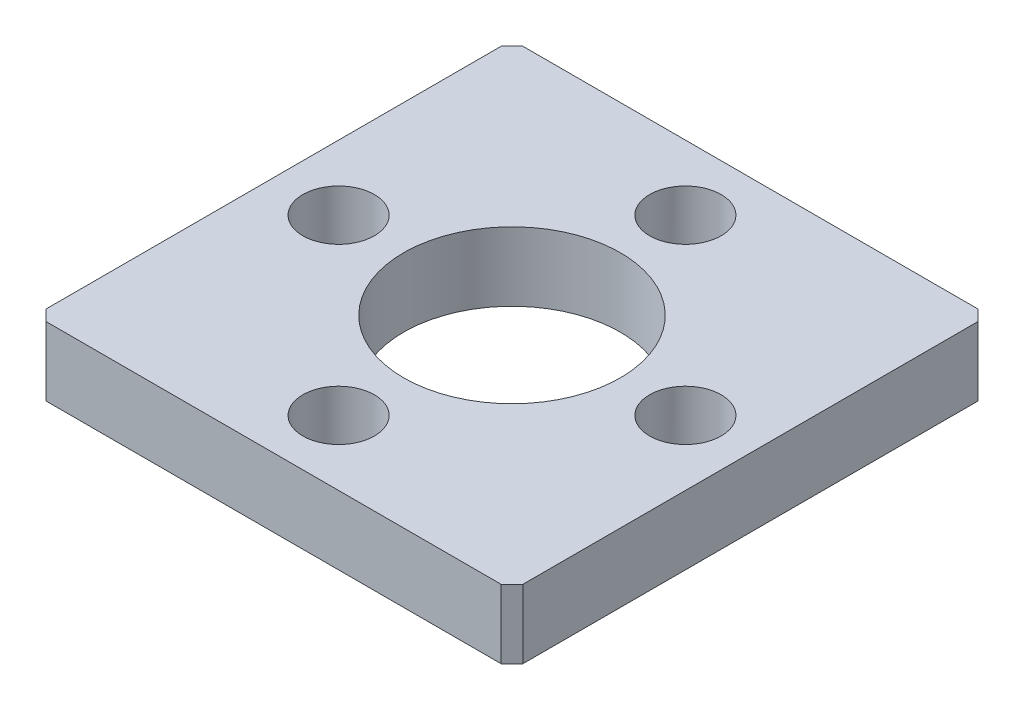
ISO-10303-21;
HEADER;
FILE_DESCRIPTION(('STEP AP214'),'2;1');
FILE_NAME('part.step','',(''),(''),'','','');
FILE_SCHEMA(('AUTOMOTIVE_DESIGN { 1 0 10303 214 1 1 1 1 }'));
ENDSEC;
DATA;
#1=APPLICATION_CONTEXT('core data for automotive mechanical design processes');
#2=APPLICATION_PROTOCOL_DEFINITION('international standard','automotive_design',2000,#1);
#3=PRODUCT_CONTEXT('',#1,'mechanical');
#4=PRODUCT('Part','Part','',(#3));
#5=PRODUCT_RELATED_PRODUCT_CATEGORY('part','',(#4));
#6=PRODUCT_DEFINITION_FORMATION('','',#4);
#7=PRODUCT_DEFINITION_CONTEXT('part definition',#1,'design');
#8=PRODUCT_DEFINITION('design','',#6,#7);
#9=PRODUCT_DEFINITION_SHAPE('','',#8);
#10=(LENGTH_UNIT() NAMED_UNIT(*) SI_UNIT(.MILLI.,.METRE.));
#11=(NAMED_UNIT(*) PLANE_ANGLE_UNIT() SI_UNIT($,.RADIAN.));
#12=(NAMED_UNIT(*) SI_UNIT($,.STERADIAN.) SOLID_ANGLE_UNIT());
#13=UNCERTAINTY_MEASURE_WITH_UNIT(LENGTH_MEASURE(1.E-05),#10,'distance_accuracy_value','');
#14=(GEOMETRIC_REPRESENTATION_CONTEXT(3) GLOBAL_UNCERTAINTY_ASSIGNED_CONTEXT((#13)) GLOBAL_UNIT_ASSIGNED_CONTEXT((#10,
#11,#12)) REPRESENTATION_CONTEXT('',''));
#15=CARTESIAN_POINT('',(0.,0.,0.));
#16=DIRECTION('',(0.,0.,1.));
#17=DIRECTION('',(1.,0.,0.));
#18=AXIS2_PLACEMENT_3D('',#15,#16,#17);
#19=CARTESIAN_POINT('',(11.,3.175,11.));
#20=DIRECTION('',(-1.,0.,0.));
#21=DIRECTION('',(0.,0.,1.));
#22=AXIS2_PLACEMENT_3D('',#19,#20,#21);
#23=PLANE('',#22);
#24=DIRECTION('',(0.,0.,-1.));
#25=VECTOR('',#24,1.);
#26=CARTESIAN_POINT('',(11.,0.,11.));
#27=LINE('',#26,#25);
#28=CARTESIAN_POINT('',(11.,0.,10.5));
#29=VERTEX_POINT('',#28);
#30=CARTESIAN_POINT('',(11.,0.,-10.5));
#31=VERTEX_POINT('',#30);
#32=EDGE_CURVE('E145',#29,#31,#27,.T.);
#33=ORIENTED_EDGE('',*,*,#32,.T.);
#34=DIRECTION('',(0.,1.,0.));
#35=VECTOR('',#34,1.);
#36=CARTESIAN_POINT('',(11.,3.175,-10.5));
#37=LINE('',#36,#35);
#38=CARTESIAN_POINT('',(11.,3.175,-10.5));
#39=VERTEX_POINT('',#38);
#40=EDGE_CURVE('E179',#31,#39,#37,.T.);
#41=ORIENTED_EDGE('',*,*,#40,.T.);
#42=DIRECTION('',(0.,0.,-1.));
#43=VECTOR('',#42,1.);
#44=CARTESIAN_POINT('',(11.,3.175,11.));
#45=LINE('',#44,#43);
#46=CARTESIAN_POINT('',(11.,3.175,10.5));
#47=VERTEX_POINT('',#46);
#48=EDGE_CURVE('E143',#47,#39,#45,.T.);
#49=ORIENTED_EDGE('',*,*,#48,.F.);
#50=DIRECTION('',(0.,-1.,0.));
#51=VECTOR('',#50,1.);
#52=CARTESIAN_POINT('',(11.,3.175,10.5));
#53=LINE('',#52,#51);
#54=EDGE_CURVE('E175',#47,#29,#53,.T.);
#55=ORIENTED_EDGE('',*,*,#54,.T.);
#56=EDGE_LOOP('',(#33,#41,#49,#55));
#57=FACE_BOUND('',#56,.T.);
#58=ADVANCED_FACE('F41',(#57),#23,.F.);
#59=CARTESIAN_POINT('',(-11.,3.175,-11.));
#60=DIRECTION('',(0.,0.,1.));
#61=DIRECTION('',(1.,0.,0.));
#62=AXIS2_PLACEMENT_3D('',#59,#60,#61);
#63=PLANE('',#62);
#64=DIRECTION('',(-1.,0.,0.));
#65=VECTOR('',#64,1.);
#66=CARTESIAN_POINT('',(-11.,0.,-11.));
#67=LINE('',#66,#65);
#68=CARTESIAN_POINT('',(10.5,0.,-11.));
#69=VERTEX_POINT('',#68);
#70=CARTESIAN_POINT('',(-10.5,0.,-11.));
#71=VERTEX_POINT('',#70);
#72=EDGE_CURVE('E139',#69,#71,#67,.T.);
#73=ORIENTED_EDGE('',*,*,#72,.T.);
#74=DIRECTION('',(0.,1.,0.));
#75=VECTOR('',#74,1.);
#76=CARTESIAN_POINT('',(-10.5,3.175,-11.));
#77=LINE('',#76,#75);
#78=CARTESIAN_POINT('',(-10.5,3.175,-11.));
#79=VERTEX_POINT('',#78);
#80=EDGE_CURVE('E115',#71,#79,#77,.T.);
#81=ORIENTED_EDGE('',*,*,#80,.T.);
#82=DIRECTION('',(-1.,0.,0.));
#83=VECTOR('',#82,1.);
#84=CARTESIAN_POINT('',(-11.,3.175,-11.));
#85=LINE('',#84,#83);
#86=CARTESIAN_POINT('',(10.5,3.175,-11.));
#87=VERTEX_POINT('',#86);
#88=EDGE_CURVE('E227',#87,#79,#85,.T.);
#89=ORIENTED_EDGE('',*,*,#88,.F.);
#90=DIRECTION('',(0.,-1.,0.));
#91=VECTOR('',#90,1.);
#92=CARTESIAN_POINT('',(10.5,3.175,-11.));
#93=LINE('',#92,#91);
#94=EDGE_CURVE('E121',#87,#69,#93,.T.);
#95=ORIENTED_EDGE('',*,*,#94,.T.);
#96=EDGE_LOOP('',(#73,#81,#89,#95));
#97=FACE_BOUND('',#96,.T.);
#98=ADVANCED_FACE('F248',(#97),#63,.F.);
#99=CARTESIAN_POINT('',(-11.,3.175,11.));
#100=DIRECTION('',(1.,0.,0.));
#101=DIRECTION('',(0.,0.,-1.));
#102=AXIS2_PLACEMENT_3D('',#99,#100,#101);
#103=PLANE('',#102);
#104=DIRECTION('',(0.,0.,1.));
#105=VECTOR('',#104,1.);
#106=CARTESIAN_POINT('',(-11.,3.175,11.));
#107=LINE('',#106,#105);
#108=CARTESIAN_POINT('',(-11.,3.175,-10.5));
#109=VERTEX_POINT('',#108);
#110=CARTESIAN_POINT('',(-11.,3.175,10.5));
#111=VERTEX_POINT('',#110);
#112=EDGE_CURVE('E130',#109,#111,#107,.T.);
#113=ORIENTED_EDGE('',*,*,#112,.F.);
#114=DIRECTION('',(0.,-1.,0.));
#115=VECTOR('',#114,1.);
#116=CARTESIAN_POINT('',(-11.,3.175,-10.5));
#117=LINE('',#116,#115);
#118=CARTESIAN_POINT('',(-11.,0.,-10.5));
#119=VERTEX_POINT('',#118);
#120=EDGE_CURVE('E114',#109,#119,#117,.T.);
#121=ORIENTED_EDGE('',*,*,#120,.T.);
#122=DIRECTION('',(0.,0.,1.));
#123=VECTOR('',#122,1.);
#124=CARTESIAN_POINT('',(-11.,0.,11.));
#125=LINE('',#124,#123);
#126=CARTESIAN_POINT('',(-11.,0.,10.5));
#127=VERTEX_POINT('',#126);
#128=EDGE_CURVE('E128',#119,#127,#125,.T.);
#129=ORIENTED_EDGE('',*,*,#128,.T.);
#130=DIRECTION('',(0.,1.,0.));
#131=VECTOR('',#130,1.);
#132=CARTESIAN_POINT('',(-11.,3.175,10.5));
#133=LINE('',#132,#131);
#134=EDGE_CURVE('E133',#127,#111,#133,.T.);
#135=ORIENTED_EDGE('',*,*,#134,.T.);
#136=EDGE_LOOP('',(#113,#121,#129,#135));
#137=FACE_BOUND('',#136,.T.);
#138=ADVANCED_FACE('F127',(#137),#103,.F.);
#139=CARTESIAN_POINT('',(-11.,3.175,11.));
#140=DIRECTION('',(0.,0.,-1.));
#141=DIRECTION('',(-1.,0.,0.));
#142=AXIS2_PLACEMENT_3D('',#139,#140,#141);
#143=PLANE('',#142);
#144=DIRECTION('',(1.,0.,0.));
#145=VECTOR('',#144,1.);
#146=CARTESIAN_POINT('',(-11.,0.,11.));
#147=LINE('',#146,#145);
#148=CARTESIAN_POINT('',(-10.5,0.,11.));
#149=VERTEX_POINT('',#148);
#150=CARTESIAN_POINT('',(10.5,0.,11.));
#151=VERTEX_POINT('',#150);
#152=EDGE_CURVE('E138',#149,#151,#147,.T.);
#153=ORIENTED_EDGE('',*,*,#152,.T.);
#154=DIRECTION('',(0.,1.,0.));
#155=VECTOR('',#154,1.);
#156=CARTESIAN_POINT('',(10.5,3.175,11.));
#157=LINE('',#156,#155);
#158=CARTESIAN_POINT('',(10.5,3.175,11.));
#159=VERTEX_POINT('',#158);
#160=EDGE_CURVE('E11',#151,#159,#157,.T.);
#161=ORIENTED_EDGE('',*,*,#160,.T.);
#162=DIRECTION('',(1.,0.,0.));
#163=VECTOR('',#162,1.);
#164=CARTESIAN_POINT('',(-11.,3.175,11.));
#165=LINE('',#164,#163);
#166=CARTESIAN_POINT('',(-10.5,3.175,11.));
#167=VERTEX_POINT('',#166);
#168=EDGE_CURVE('E150',#167,#159,#165,.T.);
#169=ORIENTED_EDGE('',*,*,#168,.F.);
#170=DIRECTION('',(0.,-1.,0.));
#171=VECTOR('',#170,1.);
#172=CARTESIAN_POINT('',(-10.5,3.175,11.));
#173=LINE('',#172,#171);
#174=EDGE_CURVE('E52',#167,#149,#173,.T.);
#175=ORIENTED_EDGE('',*,*,#174,.T.);
#176=EDGE_LOOP('',(#153,#161,#169,#175));
#177=FACE_BOUND('',#176,.T.);
#178=ADVANCED_FACE('F255',(#177),#143,.F.);
#179=CARTESIAN_POINT('',(0.,3.175,0.));
#180=DIRECTION('',(0.,-1.,0.));
#181=DIRECTION('',(0.,0.,-1.));
#182=AXIS2_PLACEMENT_3D('',#179,#180,#181);
#183=PLANE('',#182);
#184=CARTESIAN_POINT('',(0.,3.175,-8.));
#185=DIRECTION('',(0.,1.,0.));
#186=DIRECTION('',(0.,0.,1.));
#187=AXIS2_PLACEMENT_3D('',#184,#185,#186);
#188=CIRCLE('',#187,1.64999999999999);
#189=CARTESIAN_POINT('',(0.,3.175,-6.35000000000001));
#190=VERTEX_POINT('',#189);
#191=EDGE_CURVE('E206',#190,#190,#188,.T.);
#192=ORIENTED_EDGE('',*,*,#191,.F.);
#193=EDGE_LOOP('',(#192));
#194=FACE_BOUND('',#193,.T.);
#195=CARTESIAN_POINT('',(8.,3.175,0.));
#196=DIRECTION('',(0.,1.,0.));
#197=DIRECTION('',(0.,0.,1.));
#198=AXIS2_PLACEMENT_3D('',#195,#196,#197);
#199=CIRCLE('',#198,1.64999999999999);
#200=CARTESIAN_POINT('',(8.,3.175,1.65000000000002));
#201=VERTEX_POINT('',#200);
#202=EDGE_CURVE('E193',#201,#201,#199,.T.);
#203=ORIENTED_EDGE('',*,*,#202,.F.);
#204=EDGE_LOOP('',(#203));
#205=FACE_BOUND('',#204,.T.);
#206=CARTESIAN_POINT('',(0.,3.175,8.));
#207=DIRECTION('',(0.,1.,0.));
#208=DIRECTION('',(0.,0.,1.));
#209=AXIS2_PLACEMENT_3D('',#206,#207,#208);
#210=CIRCLE('',#209,1.64999999999999);
#211=CARTESIAN_POINT('',(0.,3.175,9.64999999999999));
#212=VERTEX_POINT('',#211);
#213=EDGE_CURVE('E189',#212,#212,#210,.T.);
#214=ORIENTED_EDGE('',*,*,#213,.F.);
#215=EDGE_LOOP('',(#214));
#216=FACE_BOUND('',#215,.T.);
#217=CARTESIAN_POINT('',(-8.,3.175,0.));
#218=DIRECTION('',(0.,1.,0.));
#219=DIRECTION('',(0.,0.,1.));
#220=AXIS2_PLACEMENT_3D('',#217,#218,#219);
#221=CIRCLE('',#220,1.64999999999999);
#222=CARTESIAN_POINT('',(-8.,3.175,1.6499999999999));
#223=VERTEX_POINT('',#222);
#224=EDGE_CURVE('E188',#223,#223,#221,.T.);
#225=ORIENTED_EDGE('',*,*,#224,.F.);
#226=EDGE_LOOP('',(#225));
#227=FACE_BOUND('',#226,.T.);
#228=CARTESIAN_POINT('',(0.,3.175,0.));
#229=DIRECTION('',(0.,1.,0.));
#230=DIRECTION('',(0.,0.,1.));
#231=AXIS2_PLACEMENT_3D('',#228,#229,#230);
#232=CIRCLE('',#231,5.);
#233=CARTESIAN_POINT('',(0.,3.175,5.));
#234=VERTEX_POINT('',#233);
#235=EDGE_CURVE('E216',#234,#234,#232,.T.);
#236=ORIENTED_EDGE('',*,*,#235,.F.);
#237=EDGE_LOOP('',(#236));
#238=FACE_BOUND('',#237,.T.);
#239=ORIENTED_EDGE('',*,*,#88,.T.);
#240=DIRECTION('',(0.707106781186548,0.,-0.707106781186548));
#241=VECTOR('',#240,1.);
#242=CARTESIAN_POINT('',(-11.,3.175,-10.5));
#243=LINE('',#242,#241);
#244=EDGE_CURVE('E172',#79,#109,#243,.F.);
#245=ORIENTED_EDGE('',*,*,#244,.T.);
#246=ORIENTED_EDGE('',*,*,#112,.T.);
#247=DIRECTION('',(-0.707106781186548,0.,-0.707106781186548));
#248=VECTOR('',#247,1.);
#249=CARTESIAN_POINT('',(-10.5,3.175,11.));
#250=LINE('',#249,#248);
#251=EDGE_CURVE('E65',#111,#167,#250,.F.);
#252=ORIENTED_EDGE('',*,*,#251,.T.);
#253=ORIENTED_EDGE('',*,*,#168,.T.);
#254=DIRECTION('',(-0.707106781186548,0.,0.707106781186548));
#255=VECTOR('',#254,1.);
#256=CARTESIAN_POINT('',(11.,3.175,10.5));
#257=LINE('',#256,#255);
#258=EDGE_CURVE('E166',#159,#47,#257,.F.);
#259=ORIENTED_EDGE('',*,*,#258,.T.);
#260=ORIENTED_EDGE('',*,*,#48,.T.);
#261=DIRECTION('',(0.707106781186548,0.,0.707106781186548));
#262=VECTOR('',#261,1.);
#263=CARTESIAN_POINT('',(10.5,3.175,-11.));
#264=LINE('',#263,#262);
#265=EDGE_CURVE('E169',#39,#87,#264,.F.);
#266=ORIENTED_EDGE('',*,*,#265,.T.);
#267=EDGE_LOOP('',(#239,#245,#246,#252,#253,#259,#260,#266));
#268=FACE_BOUND('',#267,.T.);
#269=ADVANCED_FACE('F246',(#194,#205,#216,#227,#238,#268),#183,.F.);
#270=CARTESIAN_POINT('',(0.,0.,0.));
#271=DIRECTION('',(0.,-1.,0.));
#272=DIRECTION('',(0.,0.,-1.));
#273=AXIS2_PLACEMENT_3D('',#270,#271,#272);
#274=PLANE('',#273);
#275=CARTESIAN_POINT('',(0.,0.,-8.));
#276=DIRECTION('',(0.,-1.,0.));
#277=DIRECTION('',(0.,0.,-1.));
#278=AXIS2_PLACEMENT_3D('',#275,#276,#277);
#279=CIRCLE('',#278,1.64999999999999);
#280=CARTESIAN_POINT('',(0.,0.,-9.65));
#281=VERTEX_POINT('',#280);
#282=EDGE_CURVE('E46',#281,#281,#279,.T.);
#283=ORIENTED_EDGE('',*,*,#282,.F.);
#284=EDGE_LOOP('',(#283));
#285=FACE_BOUND('',#284,.T.);
#286=CARTESIAN_POINT('',(8.,0.,0.));
#287=DIRECTION('',(0.,-1.,0.));
#288=DIRECTION('',(0.,0.,-1.));
#289=AXIS2_PLACEMENT_3D('',#286,#287,#288);
#290=CIRCLE('',#289,1.64999999999999);
#291=CARTESIAN_POINT('',(8.,0.,-1.64999999999997));
#292=VERTEX_POINT('',#291);
#293=EDGE_CURVE('E190',#292,#292,#290,.T.);
#294=ORIENTED_EDGE('',*,*,#293,.F.);
#295=EDGE_LOOP('',(#294));
#296=FACE_BOUND('',#295,.T.);
#297=CARTESIAN_POINT('',(0.,0.,8.));
#298=DIRECTION('',(0.,-1.,0.));
#299=DIRECTION('',(0.,0.,-1.));
#300=AXIS2_PLACEMENT_3D('',#297,#298,#299);
#301=CIRCLE('',#300,1.64999999999999);
#302=CARTESIAN_POINT('',(0.,0.,6.35));
#303=VERTEX_POINT('',#302);
#304=EDGE_CURVE('E185',#303,#303,#301,.T.);
#305=ORIENTED_EDGE('',*,*,#304,.F.);
#306=EDGE_LOOP('',(#305));
#307=FACE_BOUND('',#306,.T.);
#308=CARTESIAN_POINT('',(-8.,0.,0.));
#309=DIRECTION('',(0.,-1.,0.));
#310=DIRECTION('',(0.,0.,-1.));
#311=AXIS2_PLACEMENT_3D('',#308,#309,#310);
#312=CIRCLE('',#311,1.64999999999999);
#313=CARTESIAN_POINT('',(-8.,0.,-1.65000000000008));
#314=VERTEX_POINT('',#313);
#315=EDGE_CURVE('E212',#314,#314,#312,.T.);
#316=ORIENTED_EDGE('',*,*,#315,.F.);
#317=EDGE_LOOP('',(#316));
#318=FACE_BOUND('',#317,.T.);
#319=CARTESIAN_POINT('',(0.,0.,0.));
#320=DIRECTION('',(0.,1.,0.));
#321=DIRECTION('',(0.,0.,1.));
#322=AXIS2_PLACEMENT_3D('',#319,#320,#321);
#323=CIRCLE('',#322,5.);
#324=CARTESIAN_POINT('',(0.,0.,5.));
#325=VERTEX_POINT('',#324);
#326=EDGE_CURVE('E217',#325,#325,#323,.T.);
#327=ORIENTED_EDGE('',*,*,#326,.T.);
#328=EDGE_LOOP('',(#327));
#329=FACE_BOUND('',#328,.T.);
#330=ORIENTED_EDGE('',*,*,#128,.F.);
#331=DIRECTION('',(-0.707106781186548,0.,0.707106781186548));
#332=VECTOR('',#331,1.);
#333=CARTESIAN_POINT('',(-10.75,0.,-10.75));
#334=LINE('',#333,#332);
#335=EDGE_CURVE('E110',#119,#71,#334,.F.);
#336=ORIENTED_EDGE('',*,*,#335,.T.);
#337=ORIENTED_EDGE('',*,*,#72,.F.);
#338=DIRECTION('',(-0.707106781186548,0.,-0.707106781186548));
#339=VECTOR('',#338,1.);
#340=CARTESIAN_POINT('',(10.75,0.,-10.75));
#341=LINE('',#340,#339);
#342=EDGE_CURVE('E122',#69,#31,#341,.F.);
#343=ORIENTED_EDGE('',*,*,#342,.T.);
#344=ORIENTED_EDGE('',*,*,#32,.F.);
#345=DIRECTION('',(0.707106781186548,0.,-0.707106781186548));
#346=VECTOR('',#345,1.);
#347=CARTESIAN_POINT('',(10.75,0.,10.75));
#348=LINE('',#347,#346);
#349=EDGE_CURVE('E154',#29,#151,#348,.F.);
#350=ORIENTED_EDGE('',*,*,#349,.T.);
#351=ORIENTED_EDGE('',*,*,#152,.F.);
#352=DIRECTION('',(0.707106781186548,0.,0.707106781186548));
#353=VECTOR('',#352,1.);
#354=CARTESIAN_POINT('',(-10.75,0.,10.75));
#355=LINE('',#354,#353);
#356=EDGE_CURVE('E132',#149,#127,#355,.F.);
#357=ORIENTED_EDGE('',*,*,#356,.T.);
#358=EDGE_LOOP('',(#330,#336,#337,#343,#344,#350,#351,#357));
#359=FACE_BOUND('',#358,.T.);
#360=ADVANCED_FACE('F135',(#285,#296,#307,#318,#329,#359),#274,.T.);
#361=CARTESIAN_POINT('',(0.,0.,0.));
#362=DIRECTION('',(0.,1.,0.));
#363=DIRECTION('',(0.,0.,1.));
#364=AXIS2_PLACEMENT_3D('',#361,#362,#363);
#365=CYLINDRICAL_SURFACE('',#364,5.);
#366=ORIENTED_EDGE('',*,*,#326,.F.);
#367=EDGE_LOOP('',(#366));
#368=FACE_BOUND('',#367,.T.);
#369=ORIENTED_EDGE('',*,*,#235,.T.);
#370=EDGE_LOOP('',(#369));
#371=FACE_BOUND('',#370,.T.);
#372=ADVANCED_FACE('F266',(#368,#371),#365,.F.);
#373=CARTESIAN_POINT('',(-11.,3.175,-10.5));
#374=DIRECTION('',(0.707106781186547,0.,0.707106781186547));
#375=DIRECTION('',(0.,-1.,0.));
#376=AXIS2_PLACEMENT_3D('',#373,#374,#375);
#377=PLANE('',#376);
#378=ORIENTED_EDGE('',*,*,#244,.F.);
#379=ORIENTED_EDGE('',*,*,#80,.F.);
#380=ORIENTED_EDGE('',*,*,#335,.F.);
#381=ORIENTED_EDGE('',*,*,#120,.F.);
#382=EDGE_LOOP('',(#378,#379,#380,#381));
#383=FACE_BOUND('',#382,.T.);
#384=ADVANCED_FACE('F113',(#383),#377,.F.);
#385=CARTESIAN_POINT('',(10.5,3.175,-11.));
#386=DIRECTION('',(-0.707106781186547,0.,0.707106781186547));
#387=DIRECTION('',(0.,-1.,0.));
#388=AXIS2_PLACEMENT_3D('',#385,#386,#387);
#389=PLANE('',#388);
#390=ORIENTED_EDGE('',*,*,#265,.F.);
#391=ORIENTED_EDGE('',*,*,#40,.F.);
#392=ORIENTED_EDGE('',*,*,#342,.F.);
#393=ORIENTED_EDGE('',*,*,#94,.F.);
#394=EDGE_LOOP('',(#390,#391,#392,#393));
#395=FACE_BOUND('',#394,.T.);
#396=ADVANCED_FACE('F243',(#395),#389,.F.);
#397=CARTESIAN_POINT('',(11.,3.175,10.5));
#398=DIRECTION('',(-0.707106781186547,0.,-0.707106781186547));
#399=DIRECTION('',(0.,-1.,0.));
#400=AXIS2_PLACEMENT_3D('',#397,#398,#399);
#401=PLANE('',#400);
#402=ORIENTED_EDGE('',*,*,#258,.F.);
#403=ORIENTED_EDGE('',*,*,#160,.F.);
#404=ORIENTED_EDGE('',*,*,#349,.F.);
#405=ORIENTED_EDGE('',*,*,#54,.F.);
#406=EDGE_LOOP('',(#402,#403,#404,#405));
#407=FACE_BOUND('',#406,.T.);
#408=ADVANCED_FACE('F271',(#407),#401,.F.);
#409=CARTESIAN_POINT('',(-10.5,3.175,11.));
#410=DIRECTION('',(0.707106781186547,0.,-0.707106781186547));
#411=DIRECTION('',(0.,-1.,0.));
#412=AXIS2_PLACEMENT_3D('',#409,#410,#411);
#413=PLANE('',#412);
#414=ORIENTED_EDGE('',*,*,#251,.F.);
#415=ORIENTED_EDGE('',*,*,#134,.F.);
#416=ORIENTED_EDGE('',*,*,#356,.F.);
#417=ORIENTED_EDGE('',*,*,#174,.F.);
#418=EDGE_LOOP('',(#414,#415,#416,#417));
#419=FACE_BOUND('',#418,.T.);
#420=ADVANCED_FACE('F44',(#419),#413,.F.);
#421=CARTESIAN_POINT('',(-8.,3.175,0.));
#422=DIRECTION('',(0.,1.,0.));
#423=DIRECTION('',(0.,0.,1.));
#424=AXIS2_PLACEMENT_3D('',#421,#422,#423);
#425=CYLINDRICAL_SURFACE('',#424,1.64999999999999);
#426=ORIENTED_EDGE('',*,*,#315,.T.);
#427=EDGE_LOOP('',(#426));
#428=FACE_BOUND('',#427,.T.);
#429=ORIENTED_EDGE('',*,*,#224,.T.);
#430=EDGE_LOOP('',(#429));
#431=FACE_BOUND('',#430,.T.);
#432=ADVANCED_FACE('F279',(#428,#431),#425,.F.);
#433=CARTESIAN_POINT('',(0.,3.175,8.));
#434=DIRECTION('',(0.,1.,0.));
#435=DIRECTION('',(0.,0.,1.));
#436=AXIS2_PLACEMENT_3D('',#433,#434,#435);
#437=CYLINDRICAL_SURFACE('',#436,1.64999999999999);
#438=ORIENTED_EDGE('',*,*,#304,.T.);
#439=EDGE_LOOP('',(#438));
#440=FACE_BOUND('',#439,.T.);
#441=ORIENTED_EDGE('',*,*,#213,.T.);
#442=EDGE_LOOP('',(#441));
#443=FACE_BOUND('',#442,.T.);
#444=ADVANCED_FACE('F298',(#440,#443),#437,.F.);
#445=CARTESIAN_POINT('',(8.,3.175,0.));
#446=DIRECTION('',(0.,1.,0.));
#447=DIRECTION('',(0.,0.,1.));
#448=AXIS2_PLACEMENT_3D('',#445,#446,#447);
#449=CYLINDRICAL_SURFACE('',#448,1.64999999999999);
#450=ORIENTED_EDGE('',*,*,#293,.T.);
#451=EDGE_LOOP('',(#450));
#452=FACE_BOUND('',#451,.T.);
#453=ORIENTED_EDGE('',*,*,#202,.T.);
#454=EDGE_LOOP('',(#453));
#455=FACE_BOUND('',#454,.T.);
#456=ADVANCED_FACE('F302',(#452,#455),#449,.F.);
#457=CARTESIAN_POINT('',(0.,3.175,-8.));
#458=DIRECTION('',(0.,1.,0.));
#459=DIRECTION('',(0.,0.,1.));
#460=AXIS2_PLACEMENT_3D('',#457,#458,#459);
#461=CYLINDRICAL_SURFACE('',#460,1.64999999999999);
#462=ORIENTED_EDGE('',*,*,#282,.T.);
#463=EDGE_LOOP('',(#462));
#464=FACE_BOUND('',#463,.T.);
#465=ORIENTED_EDGE('',*,*,#191,.T.);
#466=EDGE_LOOP('',(#465));
#467=FACE_BOUND('',#466,.T.);
#468=ADVANCED_FACE('F306',(#464,#467),#461,.F.);
#469=CLOSED_SHELL('',(#58,#98,#138,#178,#269,#360,#372,#384,#396,#408,#420,#432,#444,#456,#468));
#470=MANIFOLD_SOLID_BREP('B2',#469);
#471=ADVANCED_BREP_SHAPE_REPRESENTATION('',(#18,#470),#14);
#472=SHAPE_DEFINITION_REPRESENTATION(#9,#471);
ENDSEC;
END-ISO-10303-21;
